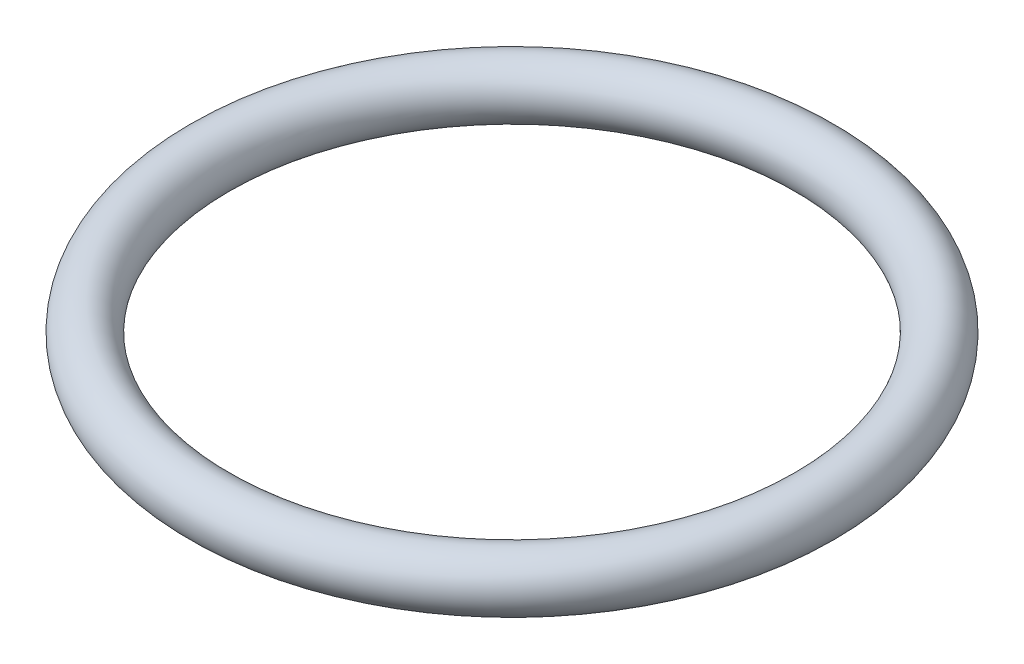
ISO-10303-21;
HEADER;
FILE_DESCRIPTION(('STEP AP214'),'2;1');
FILE_NAME('part.step','',(''),(''),'','','');
FILE_SCHEMA(('AUTOMOTIVE_DESIGN { 1 0 10303 214 1 1 1 1 }'));
ENDSEC;
DATA;
#1=APPLICATION_CONTEXT('core data for automotive mechanical design processes');
#2=APPLICATION_PROTOCOL_DEFINITION('international standard','automotive_design',2000,#1);
#3=PRODUCT_CONTEXT('',#1,'mechanical');
#4=PRODUCT('Part','Part','',(#3));
#5=PRODUCT_RELATED_PRODUCT_CATEGORY('part','',(#4));
#6=PRODUCT_DEFINITION_FORMATION('','',#4);
#7=PRODUCT_DEFINITION_CONTEXT('part definition',#1,'design');
#8=PRODUCT_DEFINITION('design','',#6,#7);
#9=PRODUCT_DEFINITION_SHAPE('','',#8);
#10=(LENGTH_UNIT() NAMED_UNIT(*) SI_UNIT(.MILLI.,.METRE.));
#11=(NAMED_UNIT(*) PLANE_ANGLE_UNIT() SI_UNIT($,.RADIAN.));
#12=(NAMED_UNIT(*) SI_UNIT($,.STERADIAN.) SOLID_ANGLE_UNIT());
#13=UNCERTAINTY_MEASURE_WITH_UNIT(LENGTH_MEASURE(1.E-05),#10,'distance_accuracy_value','');
#14=(GEOMETRIC_REPRESENTATION_CONTEXT(3) GLOBAL_UNCERTAINTY_ASSIGNED_CONTEXT((#13)) GLOBAL_UNIT_ASSIGNED_CONTEXT((#10,
#11,#12)) REPRESENTATION_CONTEXT('',''));
#15=CARTESIAN_POINT('',(0.,0.,0.));
#16=DIRECTION('',(0.,0.,1.));
#17=DIRECTION('',(1.,0.,0.));
#18=AXIS2_PLACEMENT_3D('',#15,#16,#17);
#19=CARTESIAN_POINT('',(-110.,0.,0.));
#20=DIRECTION('',(0.,1.,0.));
#21=DIRECTION('',(0.,0.,1.));
#22=AXIS2_PLACEMENT_3D('',#19,#20,#21);
#23=TOROIDAL_SURFACE('',#22,110.,10.);
#24=CARTESIAN_POINT('',(0.,0.,0.));
#25=DIRECTION('',(0.,0.,1.));
#26=DIRECTION('',(1.,0.,0.));
#27=AXIS2_PLACEMENT_3D('',#24,#25,#26);
#28=CIRCLE('',#27,10.);
#29=CARTESIAN_POINT('',(9.99999999999999,0.,0.));
#30=VERTEX_POINT('',#29);
#31=EDGE_CURVE('E10',#30,#30,#28,.T.);
#32=CARTESIAN_POINT('',(-110.,0.,0.));
#33=DIRECTION('',(0.,1.,0.));
#34=DIRECTION('',(0.,0.,1.));
#35=AXIS2_PLACEMENT_3D('',#32,#33,#34);
#36=CIRCLE('',#35,120.);
#37=EDGE_CURVE('',#30,#30,#36,.T.);
#38=ORIENTED_EDGE('',*,*,#31,.F.);
#39=ORIENTED_EDGE('',*,*,#31,.T.);
#40=ORIENTED_EDGE('',*,*,#37,.T.);
#41=ORIENTED_EDGE('',*,*,#37,.F.);
#42=EDGE_LOOP('',(#38,#40,#39,#41));
#43=FACE_BOUND('',#42,.T.);
#44=ADVANCED_FACE('F36',(#43),#23,.T.);
#45=CLOSED_SHELL('',(#44));
#46=MANIFOLD_SOLID_BREP('B2',#45);
#47=ADVANCED_BREP_SHAPE_REPRESENTATION('',(#18,#46),#14);
#48=SHAPE_DEFINITION_REPRESENTATION(#9,#47);
ENDSEC;
END-ISO-10303-21;
